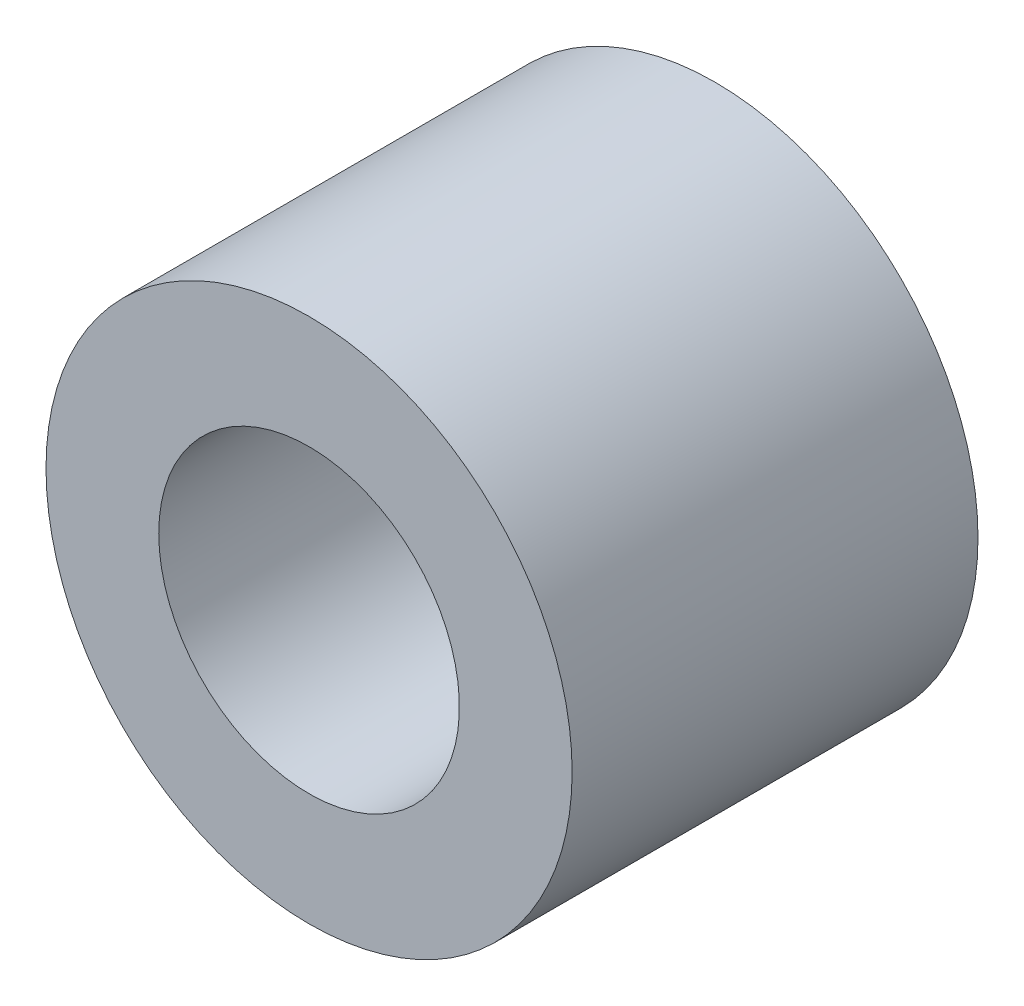
ISO-10303-21;
HEADER;
FILE_DESCRIPTION(('STEP AP214'),'2;1');
FILE_NAME('part.step','',(''),(''),'','','');
FILE_SCHEMA(('AUTOMOTIVE_DESIGN { 1 0 10303 214 1 1 1 1 }'));
ENDSEC;
DATA;
#1=APPLICATION_CONTEXT('core data for automotive mechanical design processes');
#2=APPLICATION_PROTOCOL_DEFINITION('international standard','automotive_design',2000,#1);
#3=PRODUCT_CONTEXT('',#1,'mechanical');
#4=PRODUCT('Part','Part','',(#3));
#5=PRODUCT_RELATED_PRODUCT_CATEGORY('part','',(#4));
#6=PRODUCT_DEFINITION_FORMATION('','',#4);
#7=PRODUCT_DEFINITION_CONTEXT('part definition',#1,'design');
#8=PRODUCT_DEFINITION('design','',#6,#7);
#9=PRODUCT_DEFINITION_SHAPE('','',#8);
#10=(LENGTH_UNIT() NAMED_UNIT(*) SI_UNIT(.MILLI.,.METRE.));
#11=(NAMED_UNIT(*) PLANE_ANGLE_UNIT() SI_UNIT($,.RADIAN.));
#12=(NAMED_UNIT(*) SI_UNIT($,.STERADIAN.) SOLID_ANGLE_UNIT());
#13=UNCERTAINTY_MEASURE_WITH_UNIT(LENGTH_MEASURE(1.E-05),#10,'distance_accuracy_value','');
#14=(GEOMETRIC_REPRESENTATION_CONTEXT(3) GLOBAL_UNCERTAINTY_ASSIGNED_CONTEXT((#13)) GLOBAL_UNIT_ASSIGNED_CONTEXT((#10,
#11,#12)) REPRESENTATION_CONTEXT('',''));
#15=CARTESIAN_POINT('',(0.,0.,0.));
#16=DIRECTION('',(0.,0.,1.));
#17=DIRECTION('',(1.,0.,0.));
#18=AXIS2_PLACEMENT_3D('',#15,#16,#17);
#19=CARTESIAN_POINT('',(0.,0.,5.4));
#20=DIRECTION('',(0.,0.,1.));
#21=DIRECTION('',(1.,0.,0.));
#22=AXIS2_PLACEMENT_3D('',#19,#20,#21);
#23=PLANE('',#22);
#24=CARTESIAN_POINT('',(0.,0.,5.4));
#25=DIRECTION('',(0.,0.,1.));
#26=DIRECTION('',(1.,0.,0.));
#27=AXIS2_PLACEMENT_3D('',#24,#25,#26);
#28=CIRCLE('',#27,3.5);
#29=CARTESIAN_POINT('',(-3.5,0.,5.4));
#30=VERTEX_POINT('',#29);
#31=EDGE_CURVE('E10',#30,#30,#28,.T.);
#32=ORIENTED_EDGE('',*,*,#31,.T.);
#33=EDGE_LOOP('',(#32));
#34=FACE_BOUND('',#33,.T.);
#35=CARTESIAN_POINT('',(0.,0.,5.4));
#36=DIRECTION('',(0.,0.,1.));
#37=DIRECTION('',(1.,0.,0.));
#38=AXIS2_PLACEMENT_3D('',#35,#36,#37);
#39=CIRCLE('',#38,2.);
#40=CARTESIAN_POINT('',(-2.,0.,5.4));
#41=VERTEX_POINT('',#40);
#42=EDGE_CURVE('E50',#41,#41,#39,.T.);
#43=ORIENTED_EDGE('',*,*,#42,.F.);
#44=EDGE_LOOP('',(#43));
#45=FACE_BOUND('',#44,.T.);
#46=ADVANCED_FACE('F37',(#34,#45),#23,.T.);
#47=CARTESIAN_POINT('',(0.,0.,0.));
#48=DIRECTION('',(0.,0.,1.));
#49=DIRECTION('',(1.,0.,0.));
#50=AXIS2_PLACEMENT_3D('',#47,#48,#49);
#51=PLANE('',#50);
#52=CARTESIAN_POINT('',(0.,0.,0.));
#53=DIRECTION('',(0.,0.,1.));
#54=DIRECTION('',(1.,0.,0.));
#55=AXIS2_PLACEMENT_3D('',#52,#53,#54);
#56=CIRCLE('',#55,3.5);
#57=CARTESIAN_POINT('',(-3.5,0.,0.));
#58=VERTEX_POINT('',#57);
#59=EDGE_CURVE('E41',#58,#58,#56,.T.);
#60=ORIENTED_EDGE('',*,*,#59,.F.);
#61=EDGE_LOOP('',(#60));
#62=FACE_BOUND('',#61,.T.);
#63=CARTESIAN_POINT('',(0.,0.,0.));
#64=DIRECTION('',(0.,0.,1.));
#65=DIRECTION('',(1.,0.,0.));
#66=AXIS2_PLACEMENT_3D('',#63,#64,#65);
#67=CIRCLE('',#66,2.);
#68=CARTESIAN_POINT('',(-2.,0.,0.));
#69=VERTEX_POINT('',#68);
#70=EDGE_CURVE('E52',#69,#69,#67,.T.);
#71=ORIENTED_EDGE('',*,*,#70,.T.);
#72=EDGE_LOOP('',(#71));
#73=FACE_BOUND('',#72,.T.);
#74=ADVANCED_FACE('F64',(#62,#73),#51,.F.);
#75=CARTESIAN_POINT('',(0.,0.,5.4));
#76=DIRECTION('',(0.,0.,-1.));
#77=DIRECTION('',(-1.,0.,0.));
#78=AXIS2_PLACEMENT_3D('',#75,#76,#77);
#79=CYLINDRICAL_SURFACE('',#78,3.5);
#80=CARTESIAN_POINT('',(-3.5,0.,5.4));
#81=CARTESIAN_POINT('',(-3.5,0.,5.34375));
#82=CARTESIAN_POINT('',(-3.5,0.,5.2875));
#83=CARTESIAN_POINT('',(-3.5,0.,5.175));
#84=CARTESIAN_POINT('',(-3.5,0.,5.11875));
#85=CARTESIAN_POINT('',(-3.5,0.,5.00625));
#86=CARTESIAN_POINT('',(-3.5,0.,4.95));
#87=CARTESIAN_POINT('',(-3.5,0.,4.8375));
#88=CARTESIAN_POINT('',(-3.5,0.,4.78125));
#89=CARTESIAN_POINT('',(-3.5,0.,4.66875));
#90=CARTESIAN_POINT('',(-3.5,0.,4.6125));
#91=CARTESIAN_POINT('',(-3.5,0.,4.5));
#92=CARTESIAN_POINT('',(-3.5,0.,4.44375));
#93=CARTESIAN_POINT('',(-3.5,0.,4.33125));
#94=CARTESIAN_POINT('',(-3.5,0.,4.275));
#95=CARTESIAN_POINT('',(-3.5,0.,4.1625));
#96=CARTESIAN_POINT('',(-3.5,0.,4.10625));
#97=CARTESIAN_POINT('',(-3.5,0.,3.99375));
#98=CARTESIAN_POINT('',(-3.5,0.,3.9375));
#99=CARTESIAN_POINT('',(-3.5,0.,3.825));
#100=CARTESIAN_POINT('',(-3.5,0.,3.76875));
#101=CARTESIAN_POINT('',(-3.5,0.,3.65625));
#102=CARTESIAN_POINT('',(-3.5,0.,3.6));
#103=CARTESIAN_POINT('',(-3.5,0.,3.4875));
#104=CARTESIAN_POINT('',(-3.5,0.,3.43125));
#105=CARTESIAN_POINT('',(-3.5,0.,3.31875));
#106=CARTESIAN_POINT('',(-3.5,0.,3.2625));
#107=CARTESIAN_POINT('',(-3.5,0.,3.15));
#108=CARTESIAN_POINT('',(-3.5,0.,3.09375));
#109=CARTESIAN_POINT('',(-3.5,0.,2.98125));
#110=CARTESIAN_POINT('',(-3.5,0.,2.925));
#111=CARTESIAN_POINT('',(-3.5,0.,2.8125));
#112=CARTESIAN_POINT('',(-3.5,0.,2.75625));
#113=CARTESIAN_POINT('',(-3.5,0.,2.64375));
#114=CARTESIAN_POINT('',(-3.5,0.,2.5875));
#115=CARTESIAN_POINT('',(-3.5,0.,2.475));
#116=CARTESIAN_POINT('',(-3.5,0.,2.41875));
#117=CARTESIAN_POINT('',(-3.5,0.,2.30625));
#118=CARTESIAN_POINT('',(-3.5,0.,2.25));
#119=CARTESIAN_POINT('',(-3.5,0.,2.1375));
#120=CARTESIAN_POINT('',(-3.5,0.,2.08125));
#121=CARTESIAN_POINT('',(-3.5,0.,1.96875));
#122=CARTESIAN_POINT('',(-3.5,0.,1.9125));
#123=CARTESIAN_POINT('',(-3.5,0.,1.8));
#124=CARTESIAN_POINT('',(-3.5,0.,1.74375));
#125=CARTESIAN_POINT('',(-3.5,0.,1.63125));
#126=CARTESIAN_POINT('',(-3.5,0.,1.575));
#127=CARTESIAN_POINT('',(-3.5,0.,1.4625));
#128=CARTESIAN_POINT('',(-3.5,0.,1.40625));
#129=CARTESIAN_POINT('',(-3.5,0.,1.29375));
#130=CARTESIAN_POINT('',(-3.5,0.,1.2375));
#131=CARTESIAN_POINT('',(-3.5,0.,1.125));
#132=CARTESIAN_POINT('',(-3.5,0.,1.06875));
#133=CARTESIAN_POINT('',(-3.5,0.,0.95625));
#134=CARTESIAN_POINT('',(-3.5,0.,0.9));
#135=CARTESIAN_POINT('',(-3.5,0.,0.7875));
#136=CARTESIAN_POINT('',(-3.5,0.,0.73125));
#137=CARTESIAN_POINT('',(-3.5,0.,0.618749999999999));
#138=CARTESIAN_POINT('',(-3.5,0.,0.562499999999999));
#139=CARTESIAN_POINT('',(-3.5,0.,0.449999999999999));
#140=CARTESIAN_POINT('',(-3.5,0.,0.393749999999999));
#141=CARTESIAN_POINT('',(-3.5,0.,0.281249999999999));
#142=CARTESIAN_POINT('',(-3.5,0.,0.225));
#143=CARTESIAN_POINT('',(-3.5,0.,0.112499999999999));
#144=CARTESIAN_POINT('',(-3.5,0.,0.0562499999999992));
#145=CARTESIAN_POINT('',(-3.5,0.,0.));
#146=B_SPLINE_CURVE_WITH_KNOTS('',3,(#80,#81,#82,#83,#84,#85,#86,#87,#88,#89,#90,#91,#92,#93,
#94,#95,#96,#97,#98,#99,#100,#101,#102,#103,#104,#105,#106,#107,#108,#109,#110,#111,#112,#113,
#114,#115,#116,#117,#118,#119,#120,#121,#122,#123,#124,#125,#126,#127,#128,#129,#130,#131,#132,
#133,#134,#135,#136,#137,#138,#139,#140,#141,#142,#143,#144,#145),.UNSPECIFIED.,.F.,.F.,(4,2,2,
2,2,2,2,2,2,2,2,2,2,2,2,2,2,2,2,2,2,2,2,2,2,2,2,2,2,2,2,2,4),(0.,0.168750000000001,0.3375,
0.506250000000001,0.675,0.843750000000001,1.0125,1.18125,1.35,1.51875,1.6875,1.85625,2.025,
2.19375,2.3625,2.53125,2.7,2.86875,3.0375,3.20625,3.375,3.54375,3.7125,3.88125,4.05,4.21875,
4.3875,4.55625,4.725,4.89375,5.0625,5.23125,5.4),.UNSPECIFIED.);
#147=EDGE_CURVE('BSEAM39',#30,#58,#146,.T.);
#148=ORIENTED_EDGE('',*,*,#31,.F.);
#149=ORIENTED_EDGE('',*,*,#59,.T.);
#150=ORIENTED_EDGE('',*,*,#147,.T.);
#151=ORIENTED_EDGE('',*,*,#147,.F.);
#152=EDGE_LOOP('',(#148,#150,#149,#151));
#153=FACE_BOUND('',#152,.T.);
#154=ADVANCED_FACE('F39',(#153),#79,.T.);
#155=CARTESIAN_POINT('',(0.,0.,5.4));
#156=DIRECTION('',(0.,0.,-1.));
#157=DIRECTION('',(-1.,0.,0.));
#158=AXIS2_PLACEMENT_3D('',#155,#156,#157);
#159=CYLINDRICAL_SURFACE('',#158,2.);
#160=CARTESIAN_POINT('',(-2.,0.,5.4));
#161=CARTESIAN_POINT('',(-2.,0.,5.34375));
#162=CARTESIAN_POINT('',(-2.,0.,5.2875));
#163=CARTESIAN_POINT('',(-2.,0.,5.175));
#164=CARTESIAN_POINT('',(-2.,0.,5.11875));
#165=CARTESIAN_POINT('',(-2.,0.,5.00625));
#166=CARTESIAN_POINT('',(-2.,0.,4.95));
#167=CARTESIAN_POINT('',(-2.,0.,4.8375));
#168=CARTESIAN_POINT('',(-2.,0.,4.78125));
#169=CARTESIAN_POINT('',(-2.,0.,4.66875));
#170=CARTESIAN_POINT('',(-2.,0.,4.6125));
#171=CARTESIAN_POINT('',(-2.,0.,4.5));
#172=CARTESIAN_POINT('',(-2.,0.,4.44375));
#173=CARTESIAN_POINT('',(-2.,0.,4.33125));
#174=CARTESIAN_POINT('',(-2.,0.,4.275));
#175=CARTESIAN_POINT('',(-2.,0.,4.1625));
#176=CARTESIAN_POINT('',(-2.,0.,4.10625));
#177=CARTESIAN_POINT('',(-2.,0.,3.99375));
#178=CARTESIAN_POINT('',(-2.,0.,3.9375));
#179=CARTESIAN_POINT('',(-2.,0.,3.825));
#180=CARTESIAN_POINT('',(-2.,0.,3.76875));
#181=CARTESIAN_POINT('',(-2.,0.,3.65625));
#182=CARTESIAN_POINT('',(-2.,0.,3.6));
#183=CARTESIAN_POINT('',(-2.,0.,3.4875));
#184=CARTESIAN_POINT('',(-2.,0.,3.43125));
#185=CARTESIAN_POINT('',(-2.,0.,3.31875));
#186=CARTESIAN_POINT('',(-2.,0.,3.2625));
#187=CARTESIAN_POINT('',(-2.,0.,3.15));
#188=CARTESIAN_POINT('',(-2.,0.,3.09375));
#189=CARTESIAN_POINT('',(-2.,0.,2.98125));
#190=CARTESIAN_POINT('',(-2.,0.,2.925));
#191=CARTESIAN_POINT('',(-2.,0.,2.8125));
#192=CARTESIAN_POINT('',(-2.,0.,2.75625));
#193=CARTESIAN_POINT('',(-2.,0.,2.64375));
#194=CARTESIAN_POINT('',(-2.,0.,2.5875));
#195=CARTESIAN_POINT('',(-2.,0.,2.475));
#196=CARTESIAN_POINT('',(-2.,0.,2.41875));
#197=CARTESIAN_POINT('',(-2.,0.,2.30625));
#198=CARTESIAN_POINT('',(-2.,0.,2.25));
#199=CARTESIAN_POINT('',(-2.,0.,2.1375));
#200=CARTESIAN_POINT('',(-2.,0.,2.08125));
#201=CARTESIAN_POINT('',(-2.,0.,1.96875));
#202=CARTESIAN_POINT('',(-2.,0.,1.9125));
#203=CARTESIAN_POINT('',(-2.,0.,1.8));
#204=CARTESIAN_POINT('',(-2.,0.,1.74375));
#205=CARTESIAN_POINT('',(-2.,0.,1.63125));
#206=CARTESIAN_POINT('',(-2.,0.,1.575));
#207=CARTESIAN_POINT('',(-2.,0.,1.4625));
#208=CARTESIAN_POINT('',(-2.,0.,1.40625));
#209=CARTESIAN_POINT('',(-2.,0.,1.29375));
#210=CARTESIAN_POINT('',(-2.,0.,1.2375));
#211=CARTESIAN_POINT('',(-2.,0.,1.125));
#212=CARTESIAN_POINT('',(-2.,0.,1.06875));
#213=CARTESIAN_POINT('',(-2.,0.,0.956249999999999));
#214=CARTESIAN_POINT('',(-2.,0.,0.899999999999999));
#215=CARTESIAN_POINT('',(-2.,0.,0.787499999999999));
#216=CARTESIAN_POINT('',(-2.,0.,0.731249999999999));
#217=CARTESIAN_POINT('',(-2.,0.,0.618749999999999));
#218=CARTESIAN_POINT('',(-2.,0.,0.562499999999999));
#219=CARTESIAN_POINT('',(-2.,0.,0.449999999999999));
#220=CARTESIAN_POINT('',(-2.,0.,0.393749999999999));
#221=CARTESIAN_POINT('',(-2.,0.,0.281249999999999));
#222=CARTESIAN_POINT('',(-2.,0.,0.224999999999999));
#223=CARTESIAN_POINT('',(-2.,0.,0.112499999999999));
#224=CARTESIAN_POINT('',(-2.,0.,0.0562499999999989));
#225=CARTESIAN_POINT('',(-2.,0.,0.));
#226=B_SPLINE_CURVE_WITH_KNOTS('',3,(#160,#161,#162,#163,#164,#165,#166,#167,#168,#169,#170,
#171,#172,#173,#174,#175,#176,#177,#178,#179,#180,#181,#182,#183,#184,#185,#186,#187,#188,#189,
#190,#191,#192,#193,#194,#195,#196,#197,#198,#199,#200,#201,#202,#203,#204,#205,#206,#207,#208,
#209,#210,#211,#212,#213,#214,#215,#216,#217,#218,#219,#220,#221,#222,#223,#224,#225),
.UNSPECIFIED.,.F.,.F.,(4,2,2,2,2,2,2,2,2,2,2,2,2,2,2,2,2,2,2,2,2,2,2,2,2,2,2,2,2,2,2,2,4),(0.,
0.16875,0.337499999999999,0.50625,0.674999999999999,0.84375,1.0125,1.18125,1.35,1.51875,1.6875,
1.85625,2.025,2.19375,2.3625,2.53125,2.7,2.86875,3.0375,3.20625,3.375,3.54375,3.7125,3.88125,
4.05,4.21875,4.3875,4.55625,4.725,4.89375,5.0625,5.23125,5.4),.UNSPECIFIED.);
#227=EDGE_CURVE('BSEAM60',#41,#69,#226,.T.);
#228=ORIENTED_EDGE('',*,*,#42,.T.);
#229=ORIENTED_EDGE('',*,*,#70,.F.);
#230=ORIENTED_EDGE('',*,*,#227,.T.);
#231=ORIENTED_EDGE('',*,*,#227,.F.);
#232=EDGE_LOOP('',(#228,#230,#229,#231));
#233=FACE_BOUND('',#232,.T.);
#234=ADVANCED_FACE('F60',(#233),#159,.F.);
#235=CLOSED_SHELL('',(#46,#74,#154,#234));
#236=MANIFOLD_SOLID_BREP('B2',#235);
#237=ADVANCED_BREP_SHAPE_REPRESENTATION('',(#18,#236),#14);
#238=SHAPE_DEFINITION_REPRESENTATION(#9,#237);
ENDSEC;
END-ISO-10303-21;
